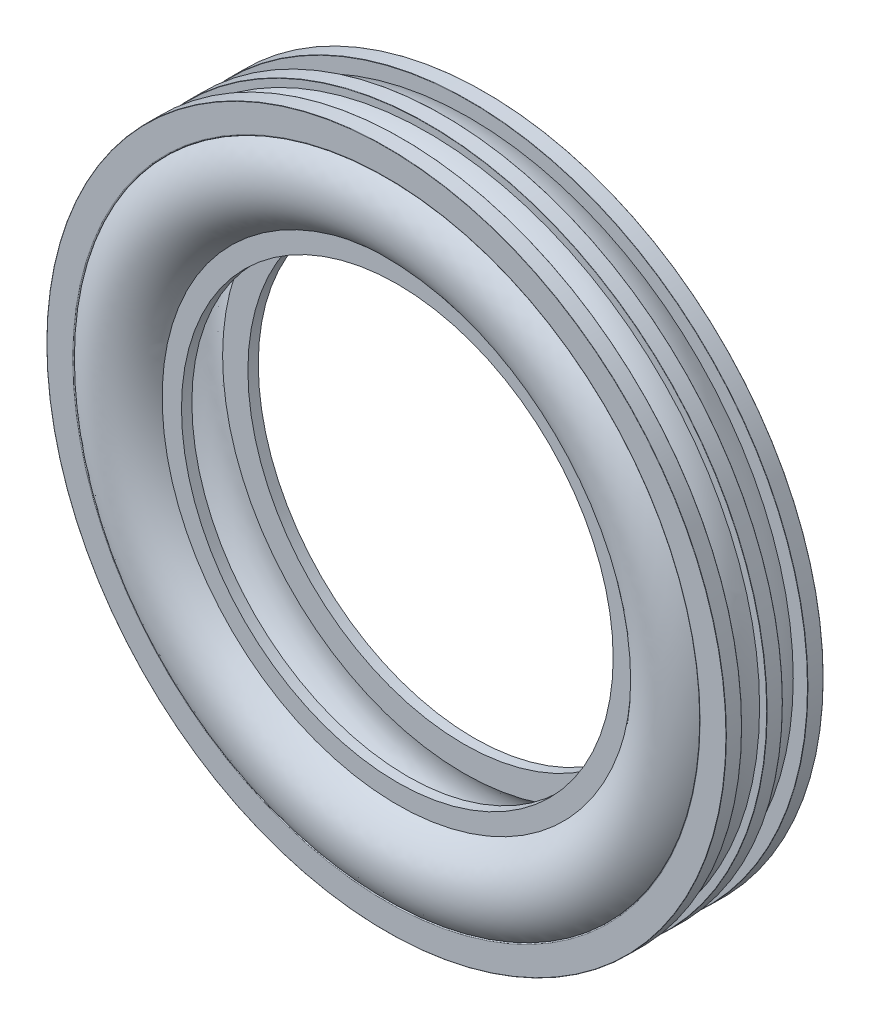
ISO-10303-21;
HEADER;
FILE_DESCRIPTION(('STEP AP214'),'2;1');
FILE_NAME('part.step','',(''),(''),'','','');
FILE_SCHEMA(('AUTOMOTIVE_DESIGN { 1 0 10303 214 1 1 1 1 }'));
ENDSEC;
DATA;
#1=APPLICATION_CONTEXT('core data for automotive mechanical design processes');
#2=APPLICATION_PROTOCOL_DEFINITION('international standard','automotive_design',2000,#1);
#3=PRODUCT_CONTEXT('',#1,'mechanical');
#4=PRODUCT('Part','Part','',(#3));
#5=PRODUCT_RELATED_PRODUCT_CATEGORY('part','',(#4));
#6=PRODUCT_DEFINITION_FORMATION('','',#4);
#7=PRODUCT_DEFINITION_CONTEXT('part definition',#1,'design');
#8=PRODUCT_DEFINITION('design','',#6,#7);
#9=PRODUCT_DEFINITION_SHAPE('','',#8);
#10=(LENGTH_UNIT() NAMED_UNIT(*) SI_UNIT(.MILLI.,.METRE.));
#11=(NAMED_UNIT(*) PLANE_ANGLE_UNIT() SI_UNIT($,.RADIAN.));
#12=(NAMED_UNIT(*) SI_UNIT($,.STERADIAN.) SOLID_ANGLE_UNIT());
#13=UNCERTAINTY_MEASURE_WITH_UNIT(LENGTH_MEASURE(1.E-05),#10,'distance_accuracy_value','');
#14=(GEOMETRIC_REPRESENTATION_CONTEXT(3) GLOBAL_UNCERTAINTY_ASSIGNED_CONTEXT((#13)) GLOBAL_UNIT_ASSIGNED_CONTEXT((#10,
#11,#12)) REPRESENTATION_CONTEXT('',''));
#15=CARTESIAN_POINT('',(0.,0.,0.));
#16=DIRECTION('',(0.,0.,1.));
#17=DIRECTION('',(1.,0.,0.));
#18=AXIS2_PLACEMENT_3D('',#15,#16,#17);
#19=CARTESIAN_POINT('',(-226.616885809323,0.,-37.));
#20=CARTESIAN_POINT('',(-228.220112988529,0.,-39.4714944717655));
#21=CARTESIAN_POINT('',(-229.991961072921,0.,-41.8092240261153));
#22=CARTESIAN_POINT('',(-233.843868646489,0.,-46.1574785732364));
#23=CARTESIAN_POINT('',(-235.924018450133,0.,-48.1679642957583));
#24=CARTESIAN_POINT('',(-240.354207799018,0.,-51.8034903006628));
#25=CARTESIAN_POINT('',(-242.704346888262,0.,-53.4284170365578));
#26=CARTESIAN_POINT('',(-247.623801444621,0.,-56.2381670332553));
#27=CARTESIAN_POINT('',(-250.193155843044,0.,-57.4227835397703));
#28=CARTESIAN_POINT('',(-255.485545674905,0.,-59.3056191152634));
#29=CARTESIAN_POINT('',(-258.208472092355,0.,-60.0035898187376));
#30=CARTESIAN_POINT('',(-263.728465676859,0.,-60.8823226019778));
#31=CARTESIAN_POINT('',(-266.525256959534,0.,-61.0629228308441));
#32=CARTESIAN_POINT('',(-272.105217003423,0.,-60.8982747642588));
#33=CARTESIAN_POINT('',(-274.888052655228,0.,-60.5530595005648));
#34=CARTESIAN_POINT('',(-280.353784504244,0.,-59.3525657577602));
#35=CARTESIAN_POINT('',(-283.036451435761,0.,-58.497491760621));
#36=CARTESIAN_POINT('',(-288.225996807434,0.,-56.3136942022115));
#37=CARTESIAN_POINT('',(-290.732820021806,0.,-54.9852170740352));
#38=CARTESIAN_POINT('',(-295.509704662284,0.,-51.9043578916174));
#39=CARTESIAN_POINT('',(-297.779833916427,0.,-50.1521546323276));
#40=CARTESIAN_POINT('',(-302.036770940948,0.,-46.2801895481815));
#41=CARTESIAN_POINT('',(-304.023680736238,0.,-44.1605139658926));
#42=CARTESIAN_POINT('',(-307.679154255387,0.,-39.6125521867422));
#43=CARTESIAN_POINT('',(-309.347798329195,0.,-37.1842902427124));
#44=CARTESIAN_POINT('',(-313.836613503827,0.,-29.5266376458518));
#45=CARTESIAN_POINT('',(-316.136891684099,0.,-23.9239143011841));
#46=CARTESIAN_POINT('',(-319.218502256573,0.,-12.2140595499448));
#47=CARTESIAN_POINT('',(-320.,0.,-6.10716355554509));
#48=CARTESIAN_POINT('',(-320.,0.,6.10716355554497));
#49=CARTESIAN_POINT('',(-319.218502256573,0.,12.2140595499447));
#50=CARTESIAN_POINT('',(-316.136891684099,0.,23.9239143011841));
#51=CARTESIAN_POINT('',(-313.836613503827,0.,29.5266376458517));
#52=CARTESIAN_POINT('',(-309.347798329195,0.,37.1842902427123));
#53=CARTESIAN_POINT('',(-307.679154255387,0.,39.6125521867422));
#54=CARTESIAN_POINT('',(-304.023680736238,0.,44.1605139658925));
#55=CARTESIAN_POINT('',(-302.036770940948,0.,46.2801895481815));
#56=CARTESIAN_POINT('',(-297.779833916428,0.,50.1521546323276));
#57=CARTESIAN_POINT('',(-295.509704662285,0.,51.9043578916174));
#58=CARTESIAN_POINT('',(-290.732820021806,0.,54.9852170740352));
#59=CARTESIAN_POINT('',(-288.225996807434,0.,56.3136942022115));
#60=CARTESIAN_POINT('',(-283.036451435761,0.,58.4974917606209));
#61=CARTESIAN_POINT('',(-280.353784504244,0.,59.3525657577602));
#62=CARTESIAN_POINT('',(-274.888052655228,0.,60.5530595005648));
#63=CARTESIAN_POINT('',(-272.105217003423,0.,60.8982747642588));
#64=CARTESIAN_POINT('',(-266.525256959534,0.,61.0629228308441));
#65=CARTESIAN_POINT('',(-263.728465676859,0.,60.8823226019778));
#66=CARTESIAN_POINT('',(-258.208472092355,0.,60.0035898187376));
#67=CARTESIAN_POINT('',(-255.485545674905,0.,59.3056191152634));
#68=CARTESIAN_POINT('',(-250.193155843044,0.,57.4227835397703));
#69=CARTESIAN_POINT('',(-247.623801444621,0.,56.2381670332554));
#70=CARTESIAN_POINT('',(-242.704346888262,0.,53.4284170365579));
#71=CARTESIAN_POINT('',(-240.354207799018,0.,51.8034903006628));
#72=CARTESIAN_POINT('',(-235.924018450134,0.,48.1679642957584));
#73=CARTESIAN_POINT('',(-233.843868646489,0.,46.1574785732364));
#74=CARTESIAN_POINT('',(-229.991961072921,0.,41.8092240261153));
#75=CARTESIAN_POINT('',(-228.220112988529,0.,39.4714944717656));
#76=CARTESIAN_POINT('',(-226.616885809323,0.,37.));
#77=B_SPLINE_CURVE_WITH_KNOTS('',3,(#19,#20,#21,#22,#23,#24,#25,#26,#27,#28,#29,#30,#31,#32,#33,
#34,#35,#36,#37,#38,#39,#40,#41,#42,#43,#44,#45,#46,#47,#48,#49,#50,#51,#52,#53,#54,#55,#56,#57,
#58,#59,#60,#61,#62,#63,#64,#65,#66,#67,#68,#69,#70,#71,#72,#73,#74,#75,#76),.UNSPECIFIED.,.F.,
.F.,(4,2,2,2,2,2,2,2,2,2,2,2,2,2,2,2,2,2,2,2,2,2,2,2,2,2,2,2,4),(0.,0.0312500000000001,
0.0625000000000003,0.0937500000000004,0.125000000000001,0.156250000000001,0.187500000000001,
0.218750000000001,0.250000000000001,0.281250000000001,0.312500000000001,0.343750000000001,
0.375000000000002,0.437500000000001,0.500000000000001,0.562500000000001,0.625000000000001,
0.656250000000001,0.687500000000001,0.718750000000001,0.750000000000001,0.781250000000001,
0.812500000000001,0.843750000000001,0.875,0.90625,0.9375,0.96875,1.),.UNSPECIFIED.);
#78=CARTESIAN_POINT('',(0.,0.,0.));
#79=DIRECTION('',(0.,0.,1.));
#80=AXIS1_PLACEMENT('',#78,#79);
#81=SURFACE_OF_REVOLUTION('',#77,#80);
#82=CARTESIAN_POINT('',(0.,0.,37.));
#83=DIRECTION('',(0.,0.,1.));
#84=DIRECTION('',(1.,0.,0.));
#85=AXIS2_PLACEMENT_3D('',#82,#83,#84);
#86=CIRCLE('',#85,226.616885809323);
#87=CARTESIAN_POINT('',(226.616885809323,0.,37.));
#88=VERTEX_POINT('',#87);
#89=EDGE_CURVE('E100',#88,#88,#86,.T.);
#90=ORIENTED_EDGE('',*,*,#89,.F.);
#91=EDGE_LOOP('',(#90));
#92=FACE_BOUND('',#91,.T.);
#93=CARTESIAN_POINT('',(0.,0.,46.8104632293209));
#94=DIRECTION('',(0.,0.,1.));
#95=DIRECTION('',(1.,0.,0.));
#96=AXIS2_PLACEMENT_3D('',#93,#94,#95);
#97=CIRCLE('',#96,301.396192514982);
#98=CARTESIAN_POINT('',(301.396192514982,0.,46.8104632293209));
#99=VERTEX_POINT('',#98);
#100=EDGE_CURVE('E84',#99,#99,#97,.F.);
#101=ORIENTED_EDGE('',*,*,#100,.F.);
#102=EDGE_LOOP('',(#101));
#103=FACE_BOUND('',#102,.T.);
#104=ADVANCED_FACE('F31',(#92,#103),#81,.T.);
#105=CARTESIAN_POINT('',(0.,0.,7.49390780625564));
#106=DIRECTION('',(0.,0.,1.));
#107=DIRECTION('',(1.,0.,0.));
#108=AXIS2_PLACEMENT_3D('',#105,#106,#107);
#109=CIRCLE('',#108,319.607464278645);
#110=CARTESIAN_POINT('',(319.607464278645,0.,7.49390780625564));
#111=VERTEX_POINT('',#110);
#112=EDGE_CURVE('E90',#111,#111,#109,.F.);
#113=ORIENTED_EDGE('',*,*,#112,.F.);
#114=EDGE_LOOP('',(#113));
#115=FACE_BOUND('',#114,.T.);
#116=CARTESIAN_POINT('',(0.,0.,32.4878156125113));
#117=DIRECTION('',(0.,0.,1.));
#118=DIRECTION('',(1.,0.,0.));
#119=AXIS2_PLACEMENT_3D('',#116,#117,#118);
#120=CIRCLE('',#119,312.044660009313);
#121=CARTESIAN_POINT('',(312.044660009313,0.,32.4878156125113));
#122=VERTEX_POINT('',#121);
#123=EDGE_CURVE('E87',#122,#122,#120,.T.);
#124=ORIENTED_EDGE('',*,*,#123,.F.);
#125=EDGE_LOOP('',(#124));
#126=FACE_BOUND('',#125,.T.);
#127=ADVANCED_FACE('F146',(#115,#126),#81,.T.);
#128=CARTESIAN_POINT('',(-268.,0.,0.));
#129=DIRECTION('',(0.,1.,0.));
#130=DIRECTION('',(0.,0.,-1.));
#131=AXIS2_PLACEMENT_3D('',#128,#129,#130);
#132=ELLIPSE('',#131,51.,42.);
#133=CARTESIAN_POINT('',(0.,0.,0.));
#134=DIRECTION('',(0.,0.,1.));
#135=AXIS1_PLACEMENT('',#133,#134);
#136=SURFACE_OF_REVOLUTION('',#132,#135);
#137=CARTESIAN_POINT('',(0.,0.,-32.5));
#138=DIRECTION('',(0.,0.,1.));
#139=DIRECTION('',(1.,0.,0.));
#140=AXIS2_PLACEMENT_3D('',#137,#138,#139);
#141=CIRCLE('',#140,300.367429910809);
#142=CARTESIAN_POINT('',(300.367429910809,0.,-32.5));
#143=VERTEX_POINT('',#142);
#144=EDGE_CURVE('E101',#143,#143,#141,.F.);
#145=ORIENTED_EDGE('',*,*,#144,.T.);
#146=EDGE_LOOP('',(#145));
#147=FACE_BOUND('',#146,.T.);
#148=CARTESIAN_POINT('',(0.,0.,-7.50609219374434));
#149=DIRECTION('',(0.,0.,1.));
#150=DIRECTION('',(1.,0.,0.));
#151=AXIS2_PLACEMENT_3D('',#148,#149,#150);
#152=CIRCLE('',#151,309.542619199458);
#153=CARTESIAN_POINT('',(309.542619199458,0.,-7.50609219374434));
#154=VERTEX_POINT('',#153);
#155=EDGE_CURVE('E293',#154,#154,#152,.T.);
#156=ORIENTED_EDGE('',*,*,#155,.T.);
#157=EDGE_LOOP('',(#156));
#158=FACE_BOUND('',#157,.T.);
#159=ADVANCED_FACE('F171',(#147,#158),#136,.F.);
#160=CARTESIAN_POINT('',(0.,0.,-32.5));
#161=DIRECTION('',(0.,0.,1.));
#162=DIRECTION('',(1.,0.,0.));
#163=AXIS2_PLACEMENT_3D('',#160,#161,#162);
#164=CIRCLE('',#163,312.03814506208);
#165=CARTESIAN_POINT('',(312.03814506208,0.,-32.5));
#166=VERTEX_POINT('',#165);
#167=EDGE_CURVE('E96',#166,#166,#164,.F.);
#168=ORIENTED_EDGE('',*,*,#167,.F.);
#169=EDGE_LOOP('',(#168));
#170=FACE_BOUND('',#169,.T.);
#171=CARTESIAN_POINT('',(0.,0.,-7.50609219374435));
#172=DIRECTION('',(0.,0.,1.));
#173=DIRECTION('',(1.,0.,0.));
#174=AXIS2_PLACEMENT_3D('',#171,#172,#173);
#175=CIRCLE('',#174,319.606183311071);
#176=CARTESIAN_POINT('',(319.606183311071,0.,-7.50609219374435));
#177=VERTEX_POINT('',#176);
#178=EDGE_CURVE('E93',#177,#177,#175,.T.);
#179=ORIENTED_EDGE('',*,*,#178,.F.);
#180=EDGE_LOOP('',(#179));
#181=FACE_BOUND('',#180,.T.);
#182=ADVANCED_FACE('F264',(#170,#181),#81,.T.);
#183=CARTESIAN_POINT('',(-326.,0.,-47.5));
#184=DIRECTION('',(0.,0.,1.));
#185=DIRECTION('',(1.,0.,0.));
#186=AXIS2_PLACEMENT_3D('',#183,#184,#185);
#187=PLANE('',#186);
#188=CARTESIAN_POINT('',(0.,0.,-47.5));
#189=DIRECTION('',(0.,0.,1.));
#190=DIRECTION('',(1.,0.,0.));
#191=AXIS2_PLACEMENT_3D('',#188,#189,#190);
#192=CIRCLE('',#191,301.076297464904);
#193=CARTESIAN_POINT('',(301.076297464904,0.,-47.5));
#194=VERTEX_POINT('',#193);
#195=EDGE_CURVE('E38',#194,#194,#192,.T.);
#196=ORIENTED_EDGE('',*,*,#195,.T.);
#197=EDGE_LOOP('',(#196));
#198=FACE_BOUND('',#197,.T.);
#199=CARTESIAN_POINT('',(0.,0.,-47.5));
#200=DIRECTION('',(0.,0.,1.));
#201=DIRECTION('',(1.,0.,0.));
#202=AXIS2_PLACEMENT_3D('',#199,#200,#201);
#203=CIRCLE('',#202,325.75);
#204=CARTESIAN_POINT('',(325.75,0.,-47.5));
#205=VERTEX_POINT('',#204);
#206=EDGE_CURVE('E51',#205,#205,#203,.F.);
#207=ORIENTED_EDGE('',*,*,#206,.T.);
#208=EDGE_LOOP('',(#207));
#209=FACE_BOUND('',#208,.T.);
#210=ADVANCED_FACE('F260',(#198,#209),#187,.F.);
#211=CARTESIAN_POINT('',(-326.,0.,-32.5));
#212=DIRECTION('',(0.,0.,-1.));
#213=DIRECTION('',(-1.,0.,0.));
#214=AXIS2_PLACEMENT_3D('',#211,#212,#213);
#215=PLANE('',#214);
#216=CARTESIAN_POINT('',(0.,0.,-32.5));
#217=DIRECTION('',(0.,0.,-1.));
#218=DIRECTION('',(-1.,0.,0.));
#219=AXIS2_PLACEMENT_3D('',#216,#217,#218);
#220=CIRCLE('',#219,325.75);
#221=CARTESIAN_POINT('',(-325.75,0.,-32.5));
#222=VERTEX_POINT('',#221);
#223=EDGE_CURVE('E46',#222,#222,#220,.F.);
#224=ORIENTED_EDGE('',*,*,#223,.T.);
#225=EDGE_LOOP('',(#224));
#226=FACE_BOUND('',#225,.T.);
#227=ORIENTED_EDGE('',*,*,#167,.T.);
#228=EDGE_LOOP('',(#227));
#229=FACE_BOUND('',#228,.T.);
#230=ADVANCED_FACE('F263',(#226,#229),#215,.F.);
#231=CARTESIAN_POINT('',(0.,0.,0.));
#232=DIRECTION('',(0.,0.,1.));
#233=DIRECTION('',(1.,0.,0.));
#234=AXIS2_PLACEMENT_3D('',#231,#232,#233);
#235=CYLINDRICAL_SURFACE('',#234,326.);
#236=CARTESIAN_POINT('',(0.,0.,-47.25));
#237=DIRECTION('',(0.,0.,1.));
#238=DIRECTION('',(1.,0.,0.));
#239=AXIS2_PLACEMENT_3D('',#236,#237,#238);
#240=CIRCLE('',#239,326.);
#241=CARTESIAN_POINT('',(326.,0.,-47.25));
#242=VERTEX_POINT('',#241);
#243=EDGE_CURVE('E54',#242,#242,#240,.T.);
#244=ORIENTED_EDGE('',*,*,#243,.T.);
#245=EDGE_LOOP('',(#244));
#246=FACE_BOUND('',#245,.T.);
#247=CARTESIAN_POINT('',(0.,0.,-32.75));
#248=DIRECTION('',(0.,0.,-1.));
#249=DIRECTION('',(-1.,0.,0.));
#250=AXIS2_PLACEMENT_3D('',#247,#248,#249);
#251=CIRCLE('',#250,326.);
#252=CARTESIAN_POINT('',(-326.,0.,-32.75));
#253=VERTEX_POINT('',#252);
#254=EDGE_CURVE('E57',#253,#253,#251,.T.);
#255=ORIENTED_EDGE('',*,*,#254,.T.);
#256=EDGE_LOOP('',(#255));
#257=FACE_BOUND('',#256,.T.);
#258=ADVANCED_FACE('F149',(#246,#257),#235,.T.);
#259=CARTESIAN_POINT('',(-232.368669748356,0.,-37.));
#260=DIRECTION('',(0.,0.,1.));
#261=DIRECTION('',(1.,0.,0.));
#262=AXIS2_PLACEMENT_3D('',#259,#260,#261);
#263=PLANE('',#262);
#264=CARTESIAN_POINT('',(0.,0.,-37.));
#265=DIRECTION('',(0.,0.,1.));
#266=DIRECTION('',(1.,0.,0.));
#267=AXIS2_PLACEMENT_3D('',#264,#265,#266);
#268=CIRCLE('',#267,221.449075380916);
#269=CARTESIAN_POINT('',(221.449075380916,0.,-37.));
#270=VERTEX_POINT('',#269);
#271=EDGE_CURVE('E110',#270,#270,#268,.F.);
#272=ORIENTED_EDGE('',*,*,#271,.T.);
#273=EDGE_LOOP('',(#272));
#274=FACE_BOUND('',#273,.T.);
#275=CARTESIAN_POINT('',(0.,0.,-37.));
#276=DIRECTION('',(0.,0.,1.));
#277=DIRECTION('',(1.,0.,0.));
#278=AXIS2_PLACEMENT_3D('',#275,#276,#277);
#279=CIRCLE('',#278,208.);
#280=CARTESIAN_POINT('',(208.,0.,-37.));
#281=VERTEX_POINT('',#280);
#282=EDGE_CURVE('E128',#281,#281,#279,.T.);
#283=ORIENTED_EDGE('',*,*,#282,.T.);
#284=EDGE_LOOP('',(#283));
#285=FACE_BOUND('',#284,.T.);
#286=ADVANCED_FACE('F151',(#274,#285),#263,.F.);
#287=CARTESIAN_POINT('',(0.,0.,-47.));
#288=DIRECTION('',(0.,0.,1.));
#289=DIRECTION('',(1.,0.,0.));
#290=AXIS2_PLACEMENT_3D('',#287,#288,#289);
#291=TOROIDAL_SURFACE('',#290,221.449075380916,10.);
#292=ORIENTED_EDGE('',*,*,#271,.F.);
#293=EDGE_LOOP('',(#292));
#294=FACE_BOUND('',#293,.T.);
#295=CARTESIAN_POINT('',(0.,0.,-40.9039448194109));
#296=DIRECTION('',(0.,0.,1.));
#297=DIRECTION('',(1.,0.,0.));
#298=AXIS2_PLACEMENT_3D('',#295,#296,#297);
#299=CIRCLE('',#298,229.37612472069);
#300=CARTESIAN_POINT('',(229.37612472069,0.,-40.9039448194109));
#301=VERTEX_POINT('',#300);
#302=EDGE_CURVE('E113',#301,#301,#299,.T.);
#303=ORIENTED_EDGE('',*,*,#302,.F.);
#304=EDGE_LOOP('',(#303));
#305=FACE_BOUND('',#304,.T.);
#306=ADVANCED_FACE('F154',(#294,#305),#291,.F.);
#307=CARTESIAN_POINT('',(0.,0.,-47.7685409222614));
#308=DIRECTION('',(0.,0.,1.));
#309=DIRECTION('',(1.,0.,0.));
#310=AXIS2_PLACEMENT_3D('',#307,#308,#309);
#311=CIRCLE('',#310,300.3944121244);
#312=CARTESIAN_POINT('',(300.3944121244,0.,-47.7685409222614));
#313=VERTEX_POINT('',#312);
#314=EDGE_CURVE('E10',#313,#313,#311,.F.);
#315=ORIENTED_EDGE('',*,*,#314,.T.);
#316=EDGE_LOOP('',(#315));
#317=FACE_BOUND('',#316,.T.);
#318=ORIENTED_EDGE('',*,*,#302,.T.);
#319=EDGE_LOOP('',(#318));
#320=FACE_BOUND('',#319,.T.);
#321=ADVANCED_FACE('F148',(#317,#320),#81,.T.);
#322=CARTESIAN_POINT('',(0.,0.,0.));
#323=DIRECTION('',(0.,0.,1.));
#324=DIRECTION('',(1.,0.,0.));
#325=AXIS2_PLACEMENT_3D('',#322,#323,#324);
#326=CYLINDRICAL_SURFACE('',#325,208.);
#327=CARTESIAN_POINT('',(0.,0.,-27.));
#328=DIRECTION('',(0.,0.,1.));
#329=DIRECTION('',(1.,0.,0.));
#330=AXIS2_PLACEMENT_3D('',#327,#328,#329);
#331=CIRCLE('',#330,208.);
#332=CARTESIAN_POINT('',(208.,0.,-27.));
#333=VERTEX_POINT('',#332);
#334=EDGE_CURVE('E125',#333,#333,#331,.T.);
#335=ORIENTED_EDGE('',*,*,#334,.T.);
#336=EDGE_LOOP('',(#335));
#337=FACE_BOUND('',#336,.T.);
#338=ORIENTED_EDGE('',*,*,#282,.F.);
#339=EDGE_LOOP('',(#338));
#340=FACE_BOUND('',#339,.T.);
#341=ADVANCED_FACE('F156',(#337,#340),#326,.F.);
#342=CARTESIAN_POINT('',(-232.368669748356,0.,-27.));
#343=DIRECTION('',(0.,0.,1.));
#344=DIRECTION('',(1.,0.,0.));
#345=AXIS2_PLACEMENT_3D('',#342,#343,#344);
#346=PLANE('',#345);
#347=CARTESIAN_POINT('',(0.,0.,-27.));
#348=DIRECTION('',(0.,0.,1.));
#349=DIRECTION('',(1.,0.,0.));
#350=AXIS2_PLACEMENT_3D('',#347,#348,#349);
#351=CIRCLE('',#350,232.368669748356);
#352=CARTESIAN_POINT('',(232.368669748356,0.,-27.));
#353=VERTEX_POINT('',#352);
#354=EDGE_CURVE('E122',#353,#353,#351,.T.);
#355=ORIENTED_EDGE('',*,*,#354,.T.);
#356=EDGE_LOOP('',(#355));
#357=FACE_BOUND('',#356,.T.);
#358=ORIENTED_EDGE('',*,*,#334,.F.);
#359=EDGE_LOOP('',(#358));
#360=FACE_BOUND('',#359,.T.);
#361=ADVANCED_FACE('F159',(#357,#360),#346,.T.);
#362=ORIENTED_EDGE('',*,*,#354,.F.);
#363=EDGE_LOOP('',(#362));
#364=FACE_BOUND('',#363,.T.);
#365=CARTESIAN_POINT('',(0.,0.,-33.0321426640718));
#366=DIRECTION('',(0.,0.,1.));
#367=DIRECTION('',(1.,0.,0.));
#368=AXIS2_PLACEMENT_3D('',#365,#366,#367);
#369=CIRCLE('',#368,300.);
#370=CARTESIAN_POINT('',(300.,0.,-33.0321426640718));
#371=VERTEX_POINT('',#370);
#372=EDGE_CURVE('E97',#371,#371,#369,.T.);
#373=ORIENTED_EDGE('',*,*,#372,.T.);
#374=EDGE_LOOP('',(#373));
#375=FACE_BOUND('',#374,.T.);
#376=ADVANCED_FACE('F163',(#364,#375),#136,.F.);
#377=CARTESIAN_POINT('',(0.,0.,-32.5));
#378=DIRECTION('',(0.,0.,1.));
#379=DIRECTION('',(1.,0.,0.));
#380=AXIS2_PLACEMENT_3D('',#377,#378,#379);
#381=CIRCLE('',#380,300.);
#382=CARTESIAN_POINT('',(300.,0.,-32.5));
#383=VERTEX_POINT('',#382);
#384=EDGE_CURVE('E284',#383,#383,#381,.T.);
#385=ORIENTED_EDGE('',*,*,#384,.F.);
#386=EDGE_LOOP('',(#385));
#387=FACE_BOUND('',#386,.T.);
#388=ORIENTED_EDGE('',*,*,#144,.F.);
#389=EDGE_LOOP('',(#388));
#390=FACE_BOUND('',#389,.T.);
#391=ADVANCED_FACE('F266',(#387,#390),#215,.F.);
#392=CARTESIAN_POINT('',(0.,0.,0.));
#393=DIRECTION('',(0.,0.,1.));
#394=DIRECTION('',(1.,0.,0.));
#395=AXIS2_PLACEMENT_3D('',#392,#393,#394);
#396=CYLINDRICAL_SURFACE('',#395,300.);
#397=ORIENTED_EDGE('',*,*,#372,.F.);
#398=EDGE_LOOP('',(#397));
#399=FACE_BOUND('',#398,.T.);
#400=ORIENTED_EDGE('',*,*,#384,.T.);
#401=EDGE_LOOP('',(#400));
#402=FACE_BOUND('',#401,.T.);
#403=ADVANCED_FACE('F255',(#399,#402),#396,.F.);
#404=CARTESIAN_POINT('',(-326.698096257491,0.,7.49390780625566));
#405=DIRECTION('',(0.,0.,-1.));
#406=DIRECTION('',(-1.,0.,0.));
#407=AXIS2_PLACEMENT_3D('',#404,#405,#406);
#408=PLANE('',#407);
#409=CARTESIAN_POINT('',(0.,0.,7.49390780625566));
#410=DIRECTION('',(0.,0.,-1.));
#411=DIRECTION('',(-1.,0.,0.));
#412=AXIS2_PLACEMENT_3D('',#409,#410,#411);
#413=CIRCLE('',#412,326.448096257491);
#414=CARTESIAN_POINT('',(-326.448096257491,0.,7.49390780625566));
#415=VERTEX_POINT('',#414);
#416=EDGE_CURVE('E60',#415,#415,#413,.F.);
#417=ORIENTED_EDGE('',*,*,#416,.T.);
#418=EDGE_LOOP('',(#417));
#419=FACE_BOUND('',#418,.T.);
#420=ORIENTED_EDGE('',*,*,#112,.T.);
#421=EDGE_LOOP('',(#420));
#422=FACE_BOUND('',#421,.T.);
#423=ADVANCED_FACE('F252',(#419,#422),#408,.F.);
#424=CARTESIAN_POINT('',(0.,0.,0.));
#425=DIRECTION('',(0.,0.,1.));
#426=DIRECTION('',(1.,0.,0.));
#427=AXIS2_PLACEMENT_3D('',#424,#425,#426);
#428=CYLINDRICAL_SURFACE('',#427,326.698096257491);
#429=CARTESIAN_POINT('',(0.,0.,-7.25609219374434));
#430=DIRECTION('',(0.,0.,1.));
#431=DIRECTION('',(1.,0.,0.));
#432=AXIS2_PLACEMENT_3D('',#429,#430,#431);
#433=CIRCLE('',#432,326.698096257491);
#434=CARTESIAN_POINT('',(326.698096257491,0.,-7.25609219374434));
#435=VERTEX_POINT('',#434);
#436=EDGE_CURVE('E66',#435,#435,#433,.T.);
#437=ORIENTED_EDGE('',*,*,#436,.T.);
#438=EDGE_LOOP('',(#437));
#439=FACE_BOUND('',#438,.T.);
#440=CARTESIAN_POINT('',(0.,0.,7.24390780625566));
#441=DIRECTION('',(0.,0.,-1.));
#442=DIRECTION('',(-1.,0.,0.));
#443=AXIS2_PLACEMENT_3D('',#440,#441,#442);
#444=CIRCLE('',#443,326.698096257491);
#445=CARTESIAN_POINT('',(-326.698096257491,0.,7.24390780625566));
#446=VERTEX_POINT('',#445);
#447=EDGE_CURVE('E69',#446,#446,#444,.T.);
#448=ORIENTED_EDGE('',*,*,#447,.T.);
#449=EDGE_LOOP('',(#448));
#450=FACE_BOUND('',#449,.T.);
#451=ADVANCED_FACE('F246',(#439,#450),#428,.T.);
#452=CARTESIAN_POINT('',(-326.698096257491,0.,-7.50609219374434));
#453=DIRECTION('',(0.,0.,1.));
#454=DIRECTION('',(1.,0.,0.));
#455=AXIS2_PLACEMENT_3D('',#452,#453,#454);
#456=PLANE('',#455);
#457=CARTESIAN_POINT('',(0.,0.,-7.50609219374434));
#458=DIRECTION('',(0.,0.,1.));
#459=DIRECTION('',(1.,0.,0.));
#460=AXIS2_PLACEMENT_3D('',#457,#458,#459);
#461=CIRCLE('',#460,326.448096257491);
#462=CARTESIAN_POINT('',(326.448096257491,0.,-7.50609219374434));
#463=VERTEX_POINT('',#462);
#464=EDGE_CURVE('E63',#463,#463,#461,.F.);
#465=ORIENTED_EDGE('',*,*,#464,.T.);
#466=EDGE_LOOP('',(#465));
#467=FACE_BOUND('',#466,.T.);
#468=ORIENTED_EDGE('',*,*,#178,.T.);
#469=EDGE_LOOP('',(#468));
#470=FACE_BOUND('',#469,.T.);
#471=ADVANCED_FACE('F180',(#467,#470),#456,.F.);
#472=CARTESIAN_POINT('',(0.,0.,0.));
#473=DIRECTION('',(0.,0.,1.));
#474=DIRECTION('',(1.,0.,0.));
#475=AXIS2_PLACEMENT_3D('',#472,#473,#474);
#476=CYLINDRICAL_SURFACE('',#475,208.);
#477=CARTESIAN_POINT('',(0.,0.,37.));
#478=DIRECTION('',(0.,0.,1.));
#479=DIRECTION('',(1.,0.,0.));
#480=AXIS2_PLACEMENT_3D('',#477,#478,#479);
#481=CIRCLE('',#480,208.);
#482=CARTESIAN_POINT('',(208.,0.,37.));
#483=VERTEX_POINT('',#482);
#484=EDGE_CURVE('E116',#483,#483,#481,.T.);
#485=ORIENTED_EDGE('',*,*,#484,.T.);
#486=EDGE_LOOP('',(#485));
#487=FACE_BOUND('',#486,.T.);
#488=CARTESIAN_POINT('',(0.,0.,27.));
#489=DIRECTION('',(0.,0.,1.));
#490=DIRECTION('',(1.,0.,0.));
#491=AXIS2_PLACEMENT_3D('',#488,#489,#490);
#492=CIRCLE('',#491,208.);
#493=CARTESIAN_POINT('',(208.,0.,27.));
#494=VERTEX_POINT('',#493);
#495=EDGE_CURVE('E119',#494,#494,#492,.T.);
#496=ORIENTED_EDGE('',*,*,#495,.F.);
#497=EDGE_LOOP('',(#496));
#498=FACE_BOUND('',#497,.T.);
#499=ADVANCED_FACE('F177',(#487,#498),#476,.F.);
#500=CARTESIAN_POINT('',(-232.368669748356,0.,37.));
#501=DIRECTION('',(0.,0.,-1.));
#502=DIRECTION('',(-1.,0.,0.));
#503=AXIS2_PLACEMENT_3D('',#500,#501,#502);
#504=PLANE('',#503);
#505=ORIENTED_EDGE('',*,*,#484,.F.);
#506=EDGE_LOOP('',(#505));
#507=FACE_BOUND('',#506,.T.);
#508=ORIENTED_EDGE('',*,*,#89,.T.);
#509=EDGE_LOOP('',(#508));
#510=FACE_BOUND('',#509,.T.);
#511=ADVANCED_FACE('F175',(#507,#510),#504,.F.);
#512=CARTESIAN_POINT('',(-232.368669748356,0.,27.));
#513=DIRECTION('',(0.,0.,-1.));
#514=DIRECTION('',(-1.,0.,0.));
#515=AXIS2_PLACEMENT_3D('',#512,#513,#514);
#516=PLANE('',#515);
#517=CARTESIAN_POINT('',(0.,0.,27.));
#518=DIRECTION('',(0.,0.,-1.));
#519=DIRECTION('',(-1.,0.,0.));
#520=AXIS2_PLACEMENT_3D('',#517,#518,#519);
#521=CIRCLE('',#520,226.616885809323);
#522=CARTESIAN_POINT('',(-226.616885809323,0.,27.));
#523=VERTEX_POINT('',#522);
#524=EDGE_CURVE('E104',#523,#523,#521,.T.);
#525=ORIENTED_EDGE('',*,*,#524,.T.);
#526=EDGE_LOOP('',(#525));
#527=FACE_BOUND('',#526,.T.);
#528=ORIENTED_EDGE('',*,*,#495,.T.);
#529=EDGE_LOOP('',(#528));
#530=FACE_BOUND('',#529,.T.);
#531=ADVANCED_FACE('F172',(#527,#530),#516,.T.);
#532=CARTESIAN_POINT('',(0.,0.,37.));
#533=DIRECTION('',(0.,0.,1.));
#534=DIRECTION('',(1.,0.,0.));
#535=AXIS2_PLACEMENT_3D('',#532,#533,#534);
#536=TOROIDAL_SURFACE('',#535,226.616885809323,10.);
#537=ORIENTED_EDGE('',*,*,#524,.F.);
#538=EDGE_LOOP('',(#537));
#539=FACE_BOUND('',#538,.T.);
#540=CARTESIAN_POINT('',(0.,0.,31.5578604688177));
#541=DIRECTION('',(0.,0.,1.));
#542=DIRECTION('',(1.,0.,0.));
#543=AXIS2_PLACEMENT_3D('',#540,#541,#542);
#544=CIRCLE('',#543,235.006350471811);
#545=CARTESIAN_POINT('',(235.006350471811,0.,31.5578604688177));
#546=VERTEX_POINT('',#545);
#547=EDGE_CURVE('E107',#546,#546,#544,.T.);
#548=ORIENTED_EDGE('',*,*,#547,.F.);
#549=EDGE_LOOP('',(#548));
#550=FACE_BOUND('',#549,.T.);
#551=ADVANCED_FACE('F169',(#539,#550),#536,.T.);
#552=ORIENTED_EDGE('',*,*,#547,.T.);
#553=EDGE_LOOP('',(#552));
#554=FACE_BOUND('',#553,.T.);
#555=CARTESIAN_POINT('',(0.,0.,7.49390780625566));
#556=DIRECTION('',(0.,0.,1.));
#557=DIRECTION('',(1.,0.,0.));
#558=AXIS2_PLACEMENT_3D('',#555,#556,#557);
#559=CIRCLE('',#558,309.544111036964);
#560=CARTESIAN_POINT('',(309.544111036964,0.,7.49390780625566));
#561=VERTEX_POINT('',#560);
#562=EDGE_CURVE('E288',#561,#561,#559,.F.);
#563=ORIENTED_EDGE('',*,*,#562,.T.);
#564=EDGE_LOOP('',(#563));
#565=FACE_BOUND('',#564,.T.);
#566=ADVANCED_FACE('F165',(#554,#565),#136,.F.);
#567=CARTESIAN_POINT('',(0.,0.,7.49390780625566));
#568=DIRECTION('',(0.,0.,1.));
#569=DIRECTION('',(1.,0.,0.));
#570=AXIS2_PLACEMENT_3D('',#567,#568,#569);
#571=CIRCLE('',#570,300.698096257491);
#572=CARTESIAN_POINT('',(300.698096257491,0.,7.49390780625566));
#573=VERTEX_POINT('',#572);
#574=EDGE_CURVE('E296',#573,#573,#571,.T.);
#575=ORIENTED_EDGE('',*,*,#574,.F.);
#576=EDGE_LOOP('',(#575));
#577=FACE_BOUND('',#576,.T.);
#578=ORIENTED_EDGE('',*,*,#562,.F.);
#579=EDGE_LOOP('',(#578));
#580=FACE_BOUND('',#579,.T.);
#581=ADVANCED_FACE('F168',(#577,#580),#408,.F.);
#582=CARTESIAN_POINT('',(0.,0.,-7.50609219374433));
#583=DIRECTION('',(0.,0.,1.));
#584=DIRECTION('',(1.,0.,0.));
#585=AXIS2_PLACEMENT_3D('',#582,#583,#584);
#586=CIRCLE('',#585,300.698096257491);
#587=CARTESIAN_POINT('',(300.698096257491,0.,-7.50609219374433));
#588=VERTEX_POINT('',#587);
#589=EDGE_CURVE('E299',#588,#588,#586,.T.);
#590=ORIENTED_EDGE('',*,*,#589,.T.);
#591=EDGE_LOOP('',(#590));
#592=FACE_BOUND('',#591,.T.);
#593=ORIENTED_EDGE('',*,*,#155,.F.);
#594=EDGE_LOOP('',(#593));
#595=FACE_BOUND('',#594,.T.);
#596=ADVANCED_FACE('F248',(#592,#595),#456,.F.);
#597=CARTESIAN_POINT('',(0.,0.,0.));
#598=DIRECTION('',(0.,0.,1.));
#599=DIRECTION('',(1.,0.,0.));
#600=AXIS2_PLACEMENT_3D('',#597,#598,#599);
#601=CYLINDRICAL_SURFACE('',#600,300.698096257491);
#602=ORIENTED_EDGE('',*,*,#589,.F.);
#603=EDGE_LOOP('',(#602));
#604=FACE_BOUND('',#603,.T.);
#605=ORIENTED_EDGE('',*,*,#574,.T.);
#606=EDGE_LOOP('',(#605));
#607=FACE_BOUND('',#606,.T.);
#608=ADVANCED_FACE('F240',(#604,#607),#601,.F.);
#609=CARTESIAN_POINT('',(0.,0.,0.));
#610=DIRECTION('',(0.,0.,1.));
#611=DIRECTION('',(1.,0.,0.));
#612=AXIS2_PLACEMENT_3D('',#609,#610,#611);
#613=CYLINDRICAL_SURFACE('',#612,327.396192514982);
#614=CARTESIAN_POINT('',(0.,0.,32.7378156125113));
#615=DIRECTION('',(0.,0.,1.));
#616=DIRECTION('',(1.,0.,0.));
#617=AXIS2_PLACEMENT_3D('',#614,#615,#616);
#618=CIRCLE('',#617,327.396192514982);
#619=CARTESIAN_POINT('',(327.396192514982,0.,32.7378156125113));
#620=VERTEX_POINT('',#619);
#621=EDGE_CURVE('E78',#620,#620,#618,.T.);
#622=ORIENTED_EDGE('',*,*,#621,.T.);
#623=EDGE_LOOP('',(#622));
#624=FACE_BOUND('',#623,.T.);
#625=CARTESIAN_POINT('',(0.,0.,47.2378156125113));
#626=DIRECTION('',(0.,0.,-1.));
#627=DIRECTION('',(-1.,0.,0.));
#628=AXIS2_PLACEMENT_3D('',#625,#626,#627);
#629=CIRCLE('',#628,327.396192514982);
#630=CARTESIAN_POINT('',(-327.396192514982,0.,47.2378156125113));
#631=VERTEX_POINT('',#630);
#632=EDGE_CURVE('E81',#631,#631,#629,.T.);
#633=ORIENTED_EDGE('',*,*,#632,.T.);
#634=EDGE_LOOP('',(#633));
#635=FACE_BOUND('',#634,.T.);
#636=ADVANCED_FACE('F230',(#624,#635),#613,.T.);
#637=CARTESIAN_POINT('',(-327.396192514982,0.,47.4878156125113));
#638=DIRECTION('',(0.,0.,-1.));
#639=DIRECTION('',(-1.,0.,0.));
#640=AXIS2_PLACEMENT_3D('',#637,#638,#639);
#641=PLANE('',#640);
#642=CARTESIAN_POINT('',(0.,0.,47.4878156125113));
#643=DIRECTION('',(0.,0.,-1.));
#644=DIRECTION('',(-1.,0.,0.));
#645=AXIS2_PLACEMENT_3D('',#642,#643,#644);
#646=CIRCLE('',#645,302.342711672404);
#647=CARTESIAN_POINT('',(-302.342711672404,0.,47.4878156125113));
#648=VERTEX_POINT('',#647);
#649=EDGE_CURVE('E42',#648,#648,#646,.T.);
#650=ORIENTED_EDGE('',*,*,#649,.T.);
#651=EDGE_LOOP('',(#650));
#652=FACE_BOUND('',#651,.T.);
#653=CARTESIAN_POINT('',(0.,0.,47.4878156125113));
#654=DIRECTION('',(0.,0.,-1.));
#655=DIRECTION('',(-1.,0.,0.));
#656=AXIS2_PLACEMENT_3D('',#653,#654,#655);
#657=CIRCLE('',#656,327.146192514982);
#658=CARTESIAN_POINT('',(-327.146192514982,0.,47.4878156125113));
#659=VERTEX_POINT('',#658);
#660=EDGE_CURVE('E72',#659,#659,#657,.F.);
#661=ORIENTED_EDGE('',*,*,#660,.T.);
#662=EDGE_LOOP('',(#661));
#663=FACE_BOUND('',#662,.T.);
#664=ADVANCED_FACE('F227',(#652,#663),#641,.F.);
#665=CARTESIAN_POINT('',(-327.396192514982,0.,32.4878156125113));
#666=DIRECTION('',(0.,0.,1.));
#667=DIRECTION('',(1.,0.,0.));
#668=AXIS2_PLACEMENT_3D('',#665,#666,#667);
#669=PLANE('',#668);
#670=CARTESIAN_POINT('',(0.,0.,32.4878156125113));
#671=DIRECTION('',(0.,0.,1.));
#672=DIRECTION('',(1.,0.,0.));
#673=AXIS2_PLACEMENT_3D('',#670,#671,#672);
#674=CIRCLE('',#673,327.146192514982);
#675=CARTESIAN_POINT('',(327.146192514982,0.,32.4878156125113));
#676=VERTEX_POINT('',#675);
#677=EDGE_CURVE('E75',#676,#676,#674,.F.);
#678=ORIENTED_EDGE('',*,*,#677,.T.);
#679=EDGE_LOOP('',(#678));
#680=FACE_BOUND('',#679,.T.);
#681=ORIENTED_EDGE('',*,*,#123,.T.);
#682=EDGE_LOOP('',(#681));
#683=FACE_BOUND('',#682,.T.);
#684=ADVANCED_FACE('F195',(#680,#683),#669,.F.);
#685=CARTESIAN_POINT('',(0.,0.,32.7378156125113));
#686=DIRECTION('',(0.,0.,1.));
#687=DIRECTION('',(1.,0.,0.));
#688=AXIS2_PLACEMENT_3D('',#685,#686,#687);
#689=TOROIDAL_SURFACE('',#688,327.146192514982,0.25);
#690=ORIENTED_EDGE('',*,*,#677,.F.);
#691=EDGE_LOOP('',(#690));
#692=FACE_BOUND('',#691,.T.);
#693=ORIENTED_EDGE('',*,*,#621,.F.);
#694=EDGE_LOOP('',(#693));
#695=FACE_BOUND('',#694,.T.);
#696=ADVANCED_FACE('F191',(#692,#695),#689,.T.);
#697=CARTESIAN_POINT('',(0.,0.,47.2378156125113));
#698=DIRECTION('',(0.,0.,-1.));
#699=DIRECTION('',(-1.,0.,0.));
#700=AXIS2_PLACEMENT_3D('',#697,#698,#699);
#701=TOROIDAL_SURFACE('',#700,327.146192514982,0.25);
#702=ORIENTED_EDGE('',*,*,#632,.F.);
#703=EDGE_LOOP('',(#702));
#704=FACE_BOUND('',#703,.T.);
#705=ORIENTED_EDGE('',*,*,#660,.F.);
#706=EDGE_LOOP('',(#705));
#707=FACE_BOUND('',#706,.T.);
#708=ADVANCED_FACE('F194',(#704,#707),#701,.T.);
#709=CARTESIAN_POINT('',(0.,0.,-7.25609219374434));
#710=DIRECTION('',(0.,0.,1.));
#711=DIRECTION('',(1.,0.,0.));
#712=AXIS2_PLACEMENT_3D('',#709,#710,#711);
#713=TOROIDAL_SURFACE('',#712,326.448096257491,0.25);
#714=ORIENTED_EDGE('',*,*,#464,.F.);
#715=EDGE_LOOP('',(#714));
#716=FACE_BOUND('',#715,.T.);
#717=ORIENTED_EDGE('',*,*,#436,.F.);
#718=EDGE_LOOP('',(#717));
#719=FACE_BOUND('',#718,.T.);
#720=ADVANCED_FACE('F199',(#716,#719),#713,.T.);
#721=CARTESIAN_POINT('',(0.,0.,7.24390780625566));
#722=DIRECTION('',(0.,0.,-1.));
#723=DIRECTION('',(-1.,0.,0.));
#724=AXIS2_PLACEMENT_3D('',#721,#722,#723);
#725=TOROIDAL_SURFACE('',#724,326.448096257491,0.25);
#726=ORIENTED_EDGE('',*,*,#447,.F.);
#727=EDGE_LOOP('',(#726));
#728=FACE_BOUND('',#727,.T.);
#729=ORIENTED_EDGE('',*,*,#416,.F.);
#730=EDGE_LOOP('',(#729));
#731=FACE_BOUND('',#730,.T.);
#732=ADVANCED_FACE('F203',(#728,#731),#725,.T.);
#733=CARTESIAN_POINT('',(0.,0.,-47.25));
#734=DIRECTION('',(0.,0.,1.));
#735=DIRECTION('',(1.,0.,0.));
#736=AXIS2_PLACEMENT_3D('',#733,#734,#735);
#737=TOROIDAL_SURFACE('',#736,325.75,0.25);
#738=ORIENTED_EDGE('',*,*,#206,.F.);
#739=EDGE_LOOP('',(#738));
#740=FACE_BOUND('',#739,.T.);
#741=ORIENTED_EDGE('',*,*,#243,.F.);
#742=EDGE_LOOP('',(#741));
#743=FACE_BOUND('',#742,.T.);
#744=ADVANCED_FACE('F207',(#740,#743),#737,.T.);
#745=CARTESIAN_POINT('',(0.,0.,-32.75));
#746=DIRECTION('',(0.,0.,-1.));
#747=DIRECTION('',(-1.,0.,0.));
#748=AXIS2_PLACEMENT_3D('',#745,#746,#747);
#749=TOROIDAL_SURFACE('',#748,325.75,0.25);
#750=ORIENTED_EDGE('',*,*,#254,.F.);
#751=EDGE_LOOP('',(#750));
#752=FACE_BOUND('',#751,.T.);
#753=ORIENTED_EDGE('',*,*,#223,.F.);
#754=EDGE_LOOP('',(#753));
#755=FACE_BOUND('',#754,.T.);
#756=ADVANCED_FACE('F211',(#752,#755),#749,.T.);
#757=CARTESIAN_POINT('',(0.,0.,46.4878156125113));
#758=DIRECTION('',(0.,0.,-1.));
#759=DIRECTION('',(-1.,0.,0.));
#760=AXIS2_PLACEMENT_3D('',#757,#758,#759);
#761=TOROIDAL_SURFACE('',#760,302.342711672404,1.);
#762=ORIENTED_EDGE('',*,*,#649,.F.);
#763=EDGE_LOOP('',(#762));
#764=FACE_BOUND('',#763,.T.);
#765=ORIENTED_EDGE('',*,*,#100,.T.);
#766=EDGE_LOOP('',(#765));
#767=FACE_BOUND('',#766,.T.);
#768=ADVANCED_FACE('F214',(#764,#767),#761,.T.);
#769=CARTESIAN_POINT('',(0.,0.,-48.5));
#770=DIRECTION('',(0.,0.,1.));
#771=DIRECTION('',(1.,0.,0.));
#772=AXIS2_PLACEMENT_3D('',#769,#770,#771);
#773=TOROIDAL_SURFACE('',#772,301.076297464904,1.);
#774=ORIENTED_EDGE('',*,*,#314,.F.);
#775=EDGE_LOOP('',(#774));
#776=FACE_BOUND('',#775,.T.);
#777=ORIENTED_EDGE('',*,*,#195,.F.);
#778=EDGE_LOOP('',(#777));
#779=FACE_BOUND('',#778,.T.);
#780=ADVANCED_FACE('F33',(#776,#779),#773,.F.);
#781=CLOSED_SHELL('',(#104,#127,#159,#182,#210,#230,#258,#286,#306,#321,#341,#361,#376,#391,
#403,#423,#451,#471,#499,#511,#531,#551,#566,#581,#596,#608,#636,#664,#684,#696,#708,#720,#732,
#744,#756,#768,#780));
#782=MANIFOLD_SOLID_BREP('B2',#781);
#783=ADVANCED_BREP_SHAPE_REPRESENTATION('',(#18,#782),#14);
#784=SHAPE_DEFINITION_REPRESENTATION(#9,#783);
ENDSEC;
END-ISO-10303-21;
